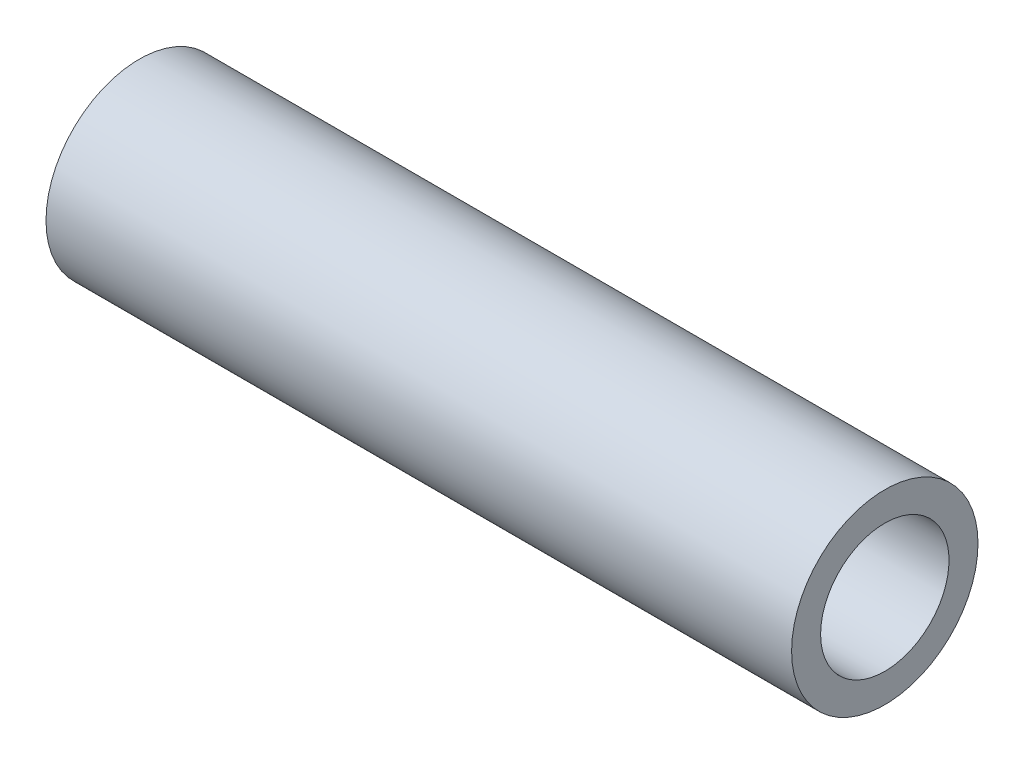
ISO-10303-21;
HEADER;
FILE_DESCRIPTION(('STEP AP214'),'2;1');
FILE_NAME('part.step','',(''),(''),'','','');
FILE_SCHEMA(('AUTOMOTIVE_DESIGN { 1 0 10303 214 1 1 1 1 }'));
ENDSEC;
DATA;
#1=APPLICATION_CONTEXT('core data for automotive mechanical design processes');
#2=APPLICATION_PROTOCOL_DEFINITION('international standard','automotive_design',2000,#1);
#3=PRODUCT_CONTEXT('',#1,'mechanical');
#4=PRODUCT('Part','Part','',(#3));
#5=PRODUCT_RELATED_PRODUCT_CATEGORY('part','',(#4));
#6=PRODUCT_DEFINITION_FORMATION('','',#4);
#7=PRODUCT_DEFINITION_CONTEXT('part definition',#1,'design');
#8=PRODUCT_DEFINITION('design','',#6,#7);
#9=PRODUCT_DEFINITION_SHAPE('','',#8);
#10=(LENGTH_UNIT() NAMED_UNIT(*) SI_UNIT(.MILLI.,.METRE.));
#11=(NAMED_UNIT(*) PLANE_ANGLE_UNIT() SI_UNIT($,.RADIAN.));
#12=(NAMED_UNIT(*) SI_UNIT($,.STERADIAN.) SOLID_ANGLE_UNIT());
#13=UNCERTAINTY_MEASURE_WITH_UNIT(LENGTH_MEASURE(1.E-05),#10,'distance_accuracy_value','');
#14=(GEOMETRIC_REPRESENTATION_CONTEXT(3) GLOBAL_UNCERTAINTY_ASSIGNED_CONTEXT((#13)) GLOBAL_UNIT_ASSIGNED_CONTEXT((#10,
#11,#12)) REPRESENTATION_CONTEXT('',''));
#15=CARTESIAN_POINT('',(0.,0.,0.));
#16=DIRECTION('',(0.,0.,1.));
#17=DIRECTION('',(1.,0.,0.));
#18=AXIS2_PLACEMENT_3D('',#15,#16,#17);
#19=CARTESIAN_POINT('',(0.,2.25,0.));
#20=DIRECTION('',(1.,0.,0.));
#21=DIRECTION('',(0.,0.,-1.));
#22=AXIS2_PLACEMENT_3D('',#19,#20,#21);
#23=PLANE('',#22);
#24=CARTESIAN_POINT('',(0.,0.,0.));
#25=DIRECTION('',(-1.,0.,0.));
#26=DIRECTION('',(0.,0.,1.));
#27=AXIS2_PLACEMENT_3D('',#24,#25,#26);
#28=CIRCLE('',#27,1.55);
#29=CARTESIAN_POINT('',(0.,0.,1.55));
#30=VERTEX_POINT('',#29);
#31=EDGE_CURVE('E10',#30,#30,#28,.T.);
#32=ORIENTED_EDGE('',*,*,#31,.F.);
#33=EDGE_LOOP('',(#32));
#34=FACE_BOUND('',#33,.T.);
#35=CARTESIAN_POINT('',(0.,0.,0.));
#36=DIRECTION('',(-1.,0.,0.));
#37=DIRECTION('',(0.,0.,1.));
#38=AXIS2_PLACEMENT_3D('',#35,#36,#37);
#39=CIRCLE('',#38,2.25);
#40=CARTESIAN_POINT('',(0.,0.,2.25));
#41=VERTEX_POINT('',#40);
#42=EDGE_CURVE('E47',#41,#41,#39,.T.);
#43=ORIENTED_EDGE('',*,*,#42,.T.);
#44=EDGE_LOOP('',(#43));
#45=FACE_BOUND('',#44,.T.);
#46=ADVANCED_FACE('F33',(#34,#45),#23,.F.);
#47=CARTESIAN_POINT('',(0.,0.,0.));
#48=DIRECTION('',(-1.,0.,0.));
#49=DIRECTION('',(0.,0.,1.));
#50=AXIS2_PLACEMENT_3D('',#47,#48,#49);
#51=CYLINDRICAL_SURFACE('',#50,1.55);
#52=CARTESIAN_POINT('',(18.,0.,0.));
#53=DIRECTION('',(-1.,0.,0.));
#54=DIRECTION('',(0.,0.,1.));
#55=AXIS2_PLACEMENT_3D('',#52,#53,#54);
#56=CIRCLE('',#55,1.55);
#57=CARTESIAN_POINT('',(18.,0.,1.55));
#58=VERTEX_POINT('',#57);
#59=EDGE_CURVE('E39',#58,#58,#56,.T.);
#60=ORIENTED_EDGE('',*,*,#59,.F.);
#61=EDGE_LOOP('',(#60));
#62=FACE_BOUND('',#61,.T.);
#63=ORIENTED_EDGE('',*,*,#31,.T.);
#64=EDGE_LOOP('',(#63));
#65=FACE_BOUND('',#64,.T.);
#66=ADVANCED_FACE('F62',(#62,#65),#51,.F.);
#67=CARTESIAN_POINT('',(18.,2.25,0.));
#68=DIRECTION('',(-1.,0.,0.));
#69=DIRECTION('',(0.,0.,1.));
#70=AXIS2_PLACEMENT_3D('',#67,#68,#69);
#71=PLANE('',#70);
#72=CARTESIAN_POINT('',(18.,0.,0.));
#73=DIRECTION('',(-1.,0.,0.));
#74=DIRECTION('',(0.,0.,1.));
#75=AXIS2_PLACEMENT_3D('',#72,#73,#74);
#76=CIRCLE('',#75,2.25);
#77=CARTESIAN_POINT('',(18.,0.,2.25));
#78=VERTEX_POINT('',#77);
#79=EDGE_CURVE('E43',#78,#78,#76,.T.);
#80=ORIENTED_EDGE('',*,*,#79,.F.);
#81=EDGE_LOOP('',(#80));
#82=FACE_BOUND('',#81,.T.);
#83=ORIENTED_EDGE('',*,*,#59,.T.);
#84=EDGE_LOOP('',(#83));
#85=FACE_BOUND('',#84,.T.);
#86=ADVANCED_FACE('F57',(#82,#85),#71,.F.);
#87=CARTESIAN_POINT('',(0.,0.,0.));
#88=DIRECTION('',(-1.,0.,0.));
#89=DIRECTION('',(0.,0.,1.));
#90=AXIS2_PLACEMENT_3D('',#87,#88,#89);
#91=CYLINDRICAL_SURFACE('',#90,2.25);
#92=ORIENTED_EDGE('',*,*,#42,.F.);
#93=EDGE_LOOP('',(#92));
#94=FACE_BOUND('',#93,.T.);
#95=ORIENTED_EDGE('',*,*,#79,.T.);
#96=EDGE_LOOP('',(#95));
#97=FACE_BOUND('',#96,.T.);
#98=ADVANCED_FACE('F54',(#94,#97),#91,.T.);
#99=CLOSED_SHELL('',(#46,#66,#86,#98));
#100=MANIFOLD_SOLID_BREP('B2',#99);
#101=ADVANCED_BREP_SHAPE_REPRESENTATION('',(#18,#100),#14);
#102=SHAPE_DEFINITION_REPRESENTATION(#9,#101);
ENDSEC;
END-ISO-10303-21;
